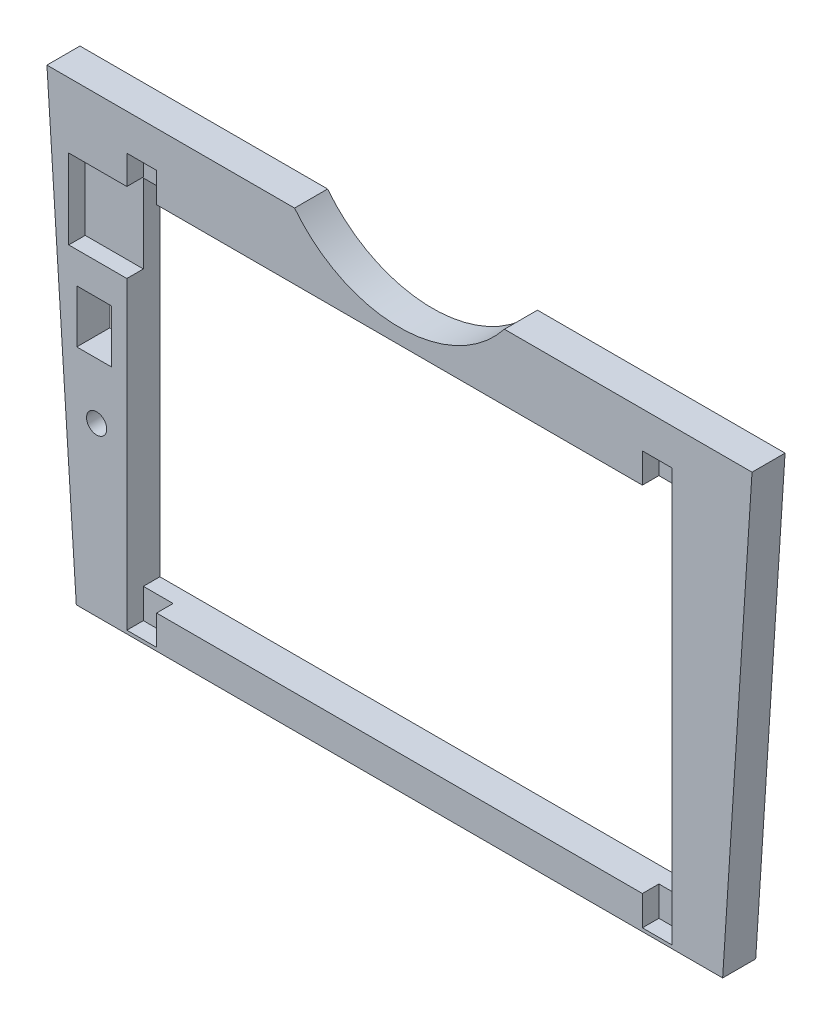
ISO-10303-21;
HEADER;
FILE_DESCRIPTION(('STEP AP214'),'2;1');
FILE_NAME('part.step','',(''),(''),'','','');
FILE_SCHEMA(('AUTOMOTIVE_DESIGN { 1 0 10303 214 1 1 1 1 }'));
ENDSEC;
DATA;
#1=APPLICATION_CONTEXT('core data for automotive mechanical design processes');
#2=APPLICATION_PROTOCOL_DEFINITION('international standard','automotive_design',2000,#1);
#3=PRODUCT_CONTEXT('',#1,'mechanical');
#4=PRODUCT('Part','Part','',(#3));
#5=PRODUCT_RELATED_PRODUCT_CATEGORY('part','',(#4));
#6=PRODUCT_DEFINITION_FORMATION('','',#4);
#7=PRODUCT_DEFINITION_CONTEXT('part definition',#1,'design');
#8=PRODUCT_DEFINITION('design','',#6,#7);
#9=PRODUCT_DEFINITION_SHAPE('','',#8);
#10=(LENGTH_UNIT() NAMED_UNIT(*) SI_UNIT(.MILLI.,.METRE.));
#11=(NAMED_UNIT(*) PLANE_ANGLE_UNIT() SI_UNIT($,.RADIAN.));
#12=(NAMED_UNIT(*) SI_UNIT($,.STERADIAN.) SOLID_ANGLE_UNIT());
#13=UNCERTAINTY_MEASURE_WITH_UNIT(LENGTH_MEASURE(1.E-05),#10,'distance_accuracy_value','');
#14=(GEOMETRIC_REPRESENTATION_CONTEXT(3) GLOBAL_UNCERTAINTY_ASSIGNED_CONTEXT((#13)) GLOBAL_UNIT_ASSIGNED_CONTEXT((#10,
#11,#12)) REPRESENTATION_CONTEXT('',''));
#15=CARTESIAN_POINT('',(0.,0.,0.));
#16=DIRECTION('',(0.,0.,1.));
#17=DIRECTION('',(1.,0.,0.));
#18=AXIS2_PLACEMENT_3D('',#15,#16,#17);
#19=CARTESIAN_POINT('',(-82.5,53.5,10.));
#20=DIRECTION('',(1.,0.,0.));
#21=DIRECTION('',(0.,0.,-1.));
#22=AXIS2_PLACEMENT_3D('',#19,#20,#21);
#23=PLANE('',#22);
#24=DIRECTION('',(0.,0.,1.));
#25=VECTOR('',#24,1.);
#26=CARTESIAN_POINT('',(-82.5,53.7645459232223,5.));
#27=LINE('',#26,#25);
#28=CARTESIAN_POINT('',(-82.5,53.7645459232223,5.));
#29=VERTEX_POINT('',#28);
#30=CARTESIAN_POINT('',(-82.5,53.7645459232223,10.));
#31=VERTEX_POINT('',#30);
#32=EDGE_CURVE('E337',#29,#31,#27,.T.);
#33=ORIENTED_EDGE('',*,*,#32,.F.);
#34=DIRECTION('',(0.,-1.,0.));
#35=VECTOR('',#34,1.);
#36=CARTESIAN_POINT('',(-82.5,53.5,5.));
#37=LINE('',#36,#35);
#38=CARTESIAN_POINT('',(-82.5,62.5,5.));
#39=VERTEX_POINT('',#38);
#40=EDGE_CURVE('E352',#39,#29,#37,.T.);
#41=ORIENTED_EDGE('',*,*,#40,.F.);
#42=DIRECTION('',(0.,0.,1.));
#43=VECTOR('',#42,1.);
#44=CARTESIAN_POINT('',(-82.5,62.5,5.));
#45=LINE('',#44,#43);
#46=CARTESIAN_POINT('',(-82.5,62.5,10.));
#47=VERTEX_POINT('',#46);
#48=EDGE_CURVE('E370',#39,#47,#45,.T.);
#49=ORIENTED_EDGE('',*,*,#48,.T.);
#50=DIRECTION('',(0.,-1.,0.));
#51=VECTOR('',#50,1.);
#52=CARTESIAN_POINT('',(-82.5,53.5,10.));
#53=LINE('',#52,#51);
#54=EDGE_CURVE('E401',#47,#31,#53,.T.);
#55=ORIENTED_EDGE('',*,*,#54,.T.);
#56=EDGE_LOOP('',(#33,#41,#49,#55));
#57=FACE_BOUND('',#56,.T.);
#58=ADVANCED_FACE('F33',(#57),#23,.T.);
#59=CARTESIAN_POINT('',(0.,98.4740542991967,10.));
#60=DIRECTION('',(0.,0.,1.));
#61=DIRECTION('',(1.,0.,0.));
#62=AXIS2_PLACEMENT_3D('',#59,#60,#61);
#63=PLANE('',#62);
#64=DIRECTION('',(1.,0.,0.));
#65=VECTOR('',#64,1.);
#66=CARTESIAN_POINT('',(-82.5,-62.5,10.));
#67=LINE('',#66,#65);
#68=CARTESIAN_POINT('',(-82.5,-62.5,10.));
#69=VERTEX_POINT('',#68);
#70=CARTESIAN_POINT('',(-73.5,-62.5,10.));
#71=VERTEX_POINT('',#70);
#72=EDGE_CURVE('E253',#69,#71,#67,.T.);
#73=ORIENTED_EDGE('',*,*,#72,.F.);
#74=CARTESIAN_POINT('',(-82.5,29.668881208007,10.));
#75=VERTEX_POINT('',#74);
#76=EDGE_CURVE('E238',#75,#69,#53,.T.);
#77=ORIENTED_EDGE('',*,*,#76,.F.);
#78=DIRECTION('',(1.,0.,0.));
#79=VECTOR('',#78,1.);
#80=CARTESIAN_POINT('',(-82.5,29.668881208007,10.));
#81=LINE('',#80,#79);
#82=CARTESIAN_POINT('',(-100.086391164183,29.668881208007,10.));
#83=VERTEX_POINT('',#82);
#84=EDGE_CURVE('E328',#83,#75,#81,.T.);
#85=ORIENTED_EDGE('',*,*,#84,.F.);
#86=DIRECTION('',(0.,-1.,0.));
#87=VECTOR('',#86,1.);
#88=CARTESIAN_POINT('',(-100.086391164183,53.7645459232223,10.));
#89=LINE('',#88,#87);
#90=CARTESIAN_POINT('',(-100.086391164183,53.7645459232223,10.));
#91=VERTEX_POINT('',#90);
#92=EDGE_CURVE('E340',#91,#83,#89,.T.);
#93=ORIENTED_EDGE('',*,*,#92,.F.);
#94=DIRECTION('',(-1.,0.,0.));
#95=VECTOR('',#94,1.);
#96=CARTESIAN_POINT('',(-82.5,53.7645459232223,10.));
#97=LINE('',#96,#95);
#98=EDGE_CURVE('E318',#31,#91,#97,.T.);
#99=ORIENTED_EDGE('',*,*,#98,.F.);
#100=ORIENTED_EDGE('',*,*,#54,.F.);
#101=DIRECTION('',(-1.,0.,0.));
#102=VECTOR('',#101,1.);
#103=CARTESIAN_POINT('',(-82.5,62.5,10.));
#104=LINE('',#103,#102);
#105=CARTESIAN_POINT('',(-73.5,62.5,10.));
#106=VERTEX_POINT('',#105);
#107=EDGE_CURVE('E356',#106,#47,#104,.T.);
#108=ORIENTED_EDGE('',*,*,#107,.F.);
#109=DIRECTION('',(0.,1.,0.));
#110=VECTOR('',#109,1.);
#111=CARTESIAN_POINT('',(-73.5,53.5,10.));
#112=LINE('',#111,#110);
#113=CARTESIAN_POINT('',(-73.5,53.5,10.));
#114=VERTEX_POINT('',#113);
#115=EDGE_CURVE('E346',#114,#106,#112,.T.);
#116=ORIENTED_EDGE('',*,*,#115,.F.);
#117=DIRECTION('',(-1.,0.,0.));
#118=VECTOR('',#117,1.);
#119=CARTESIAN_POINT('',(-82.5,53.5,10.));
#120=LINE('',#119,#118);
#121=CARTESIAN_POINT('',(73.5,53.5,10.));
#122=VERTEX_POINT('',#121);
#123=EDGE_CURVE('E408',#122,#114,#120,.T.);
#124=ORIENTED_EDGE('',*,*,#123,.F.);
#125=DIRECTION('',(0.,-1.,0.));
#126=VECTOR('',#125,1.);
#127=CARTESIAN_POINT('',(73.5,53.5,10.));
#128=LINE('',#127,#126);
#129=CARTESIAN_POINT('',(73.5,62.5,10.));
#130=VERTEX_POINT('',#129);
#131=EDGE_CURVE('E381',#130,#122,#128,.T.);
#132=ORIENTED_EDGE('',*,*,#131,.F.);
#133=DIRECTION('',(-1.,0.,0.));
#134=VECTOR('',#133,1.);
#135=CARTESIAN_POINT('',(82.5,62.5,10.));
#136=LINE('',#135,#134);
#137=CARTESIAN_POINT('',(82.5,62.5,10.));
#138=VERTEX_POINT('',#137);
#139=EDGE_CURVE('E373',#138,#130,#136,.T.);
#140=ORIENTED_EDGE('',*,*,#139,.F.);
#141=DIRECTION('',(0.,1.,0.));
#142=VECTOR('',#141,1.);
#143=CARTESIAN_POINT('',(82.5,53.5,10.));
#144=LINE('',#143,#142);
#145=CARTESIAN_POINT('',(82.5,-62.5,10.));
#146=VERTEX_POINT('',#145);
#147=EDGE_CURVE('E406',#146,#138,#144,.T.);
#148=ORIENTED_EDGE('',*,*,#147,.F.);
#149=DIRECTION('',(1.,0.,0.));
#150=VECTOR('',#149,1.);
#151=CARTESIAN_POINT('',(82.5,-62.5,10.));
#152=LINE('',#151,#150);
#153=CARTESIAN_POINT('',(73.5,-62.5,10.));
#154=VERTEX_POINT('',#153);
#155=EDGE_CURVE('E267',#154,#146,#152,.T.);
#156=ORIENTED_EDGE('',*,*,#155,.F.);
#157=DIRECTION('',(0.,-1.,0.));
#158=VECTOR('',#157,1.);
#159=CARTESIAN_POINT('',(73.5,-53.5,10.));
#160=LINE('',#159,#158);
#161=CARTESIAN_POINT('',(73.5,-53.5,10.));
#162=VERTEX_POINT('',#161);
#163=EDGE_CURVE('E262',#162,#154,#160,.T.);
#164=ORIENTED_EDGE('',*,*,#163,.F.);
#165=DIRECTION('',(1.,0.,0.));
#166=VECTOR('',#165,1.);
#167=CARTESIAN_POINT('',(-82.5,-53.5,10.));
#168=LINE('',#167,#166);
#169=CARTESIAN_POINT('',(-73.5,-53.5,10.));
#170=VERTEX_POINT('',#169);
#171=EDGE_CURVE('E404',#170,#162,#168,.T.);
#172=ORIENTED_EDGE('',*,*,#171,.F.);
#173=DIRECTION('',(0.,1.,0.));
#174=VECTOR('',#173,1.);
#175=CARTESIAN_POINT('',(-73.5,-53.5,10.));
#176=LINE('',#175,#174);
#177=EDGE_CURVE('E251',#71,#170,#176,.T.);
#178=ORIENTED_EDGE('',*,*,#177,.F.);
#179=EDGE_LOOP('',(#73,#77,#85,#93,#99,#100,#108,#116,#124,#132,#140,#148,#156,#164,#172,#178));
#180=FACE_BOUND('',#179,.T.);
#181=CARTESIAN_POINT('',(-91.6420336605306,-12.8753597057241,10.));
#182=DIRECTION('',(0.,0.,-1.));
#183=DIRECTION('',(-1.,0.,0.));
#184=AXIS2_PLACEMENT_3D('',#181,#182,#183);
#185=CIRCLE('',#184,3.04999999999999);
#186=CARTESIAN_POINT('',(-94.6920336605306,-12.8753597057241,10.));
#187=VERTEX_POINT('',#186);
#188=EDGE_CURVE('E289',#187,#187,#185,.T.);
#189=ORIENTED_EDGE('',*,*,#188,.T.);
#190=EDGE_LOOP('',(#189));
#191=FACE_BOUND('',#190,.T.);
#192=DIRECTION('',(0.,-1.,0.));
#193=VECTOR('',#192,1.);
#194=CARTESIAN_POINT('',(-87.1530670708154,20.1579655437856,10.));
#195=LINE('',#194,#193);
#196=CARTESIAN_POINT('',(-87.1530670708154,20.1579655437856,10.));
#197=VERTEX_POINT('',#196);
#198=CARTESIAN_POINT('',(-87.1530670708154,4.15796554378556,10.));
#199=VERTEX_POINT('',#198);
#200=EDGE_CURVE('E295',#197,#199,#195,.T.);
#201=ORIENTED_EDGE('',*,*,#200,.T.);
#202=DIRECTION('',(-1.,0.,0.));
#203=VECTOR('',#202,1.);
#204=CARTESIAN_POINT('',(-87.1530670708154,4.15796554378556,10.));
#205=LINE('',#204,#203);
#206=CARTESIAN_POINT('',(-97.6530670708154,4.15796554378556,10.));
#207=VERTEX_POINT('',#206);
#208=EDGE_CURVE('E298',#199,#207,#205,.T.);
#209=ORIENTED_EDGE('',*,*,#208,.T.);
#210=DIRECTION('',(0.,1.,0.));
#211=VECTOR('',#210,1.);
#212=CARTESIAN_POINT('',(-97.6530670708154,20.1579655437856,10.));
#213=LINE('',#212,#211);
#214=CARTESIAN_POINT('',(-97.6530670708154,20.1579655437856,10.));
#215=VERTEX_POINT('',#214);
#216=EDGE_CURVE('E56',#207,#215,#213,.T.);
#217=ORIENTED_EDGE('',*,*,#216,.T.);
#218=DIRECTION('',(1.,0.,0.));
#219=VECTOR('',#218,1.);
#220=CARTESIAN_POINT('',(-87.1530670708154,20.1579655437856,10.));
#221=LINE('',#220,#219);
#222=EDGE_CURVE('E303',#215,#197,#221,.T.);
#223=ORIENTED_EDGE('',*,*,#222,.T.);
#224=EDGE_LOOP('',(#201,#209,#217,#223));
#225=FACE_BOUND('',#224,.T.);
#226=DIRECTION('',(0.0647543211159097,-0.997901236544387,0.));
#227=VECTOR('',#226,1.);
#228=CARTESIAN_POINT('',(-106.68,73.5,10.));
#229=LINE('',#228,#227);
#230=CARTESIAN_POINT('',(-106.68,73.5,10.));
#231=VERTEX_POINT('',#230);
#232=CARTESIAN_POINT('',(-97.79,-63.5,10.));
#233=VERTEX_POINT('',#232);
#234=EDGE_CURVE('E431',#231,#233,#229,.T.);
#235=ORIENTED_EDGE('',*,*,#234,.T.);
#236=DIRECTION('',(1.,0.,0.));
#237=VECTOR('',#236,1.);
#238=CARTESIAN_POINT('',(-97.79,-63.5,10.));
#239=LINE('',#238,#237);
#240=CARTESIAN_POINT('',(97.79,-63.5,10.));
#241=VERTEX_POINT('',#240);
#242=EDGE_CURVE('E434',#233,#241,#239,.T.);
#243=ORIENTED_EDGE('',*,*,#242,.T.);
#244=DIRECTION('',(0.0647543211159093,0.997901236544388,0.));
#245=VECTOR('',#244,1.);
#246=CARTESIAN_POINT('',(106.68,73.5,10.));
#247=LINE('',#246,#245);
#248=CARTESIAN_POINT('',(106.68,73.5,10.));
#249=VERTEX_POINT('',#248);
#250=EDGE_CURVE('E437',#241,#249,#247,.T.);
#251=ORIENTED_EDGE('',*,*,#250,.T.);
#252=DIRECTION('',(-1.,0.,0.));
#253=VECTOR('',#252,1.);
#254=CARTESIAN_POINT('',(31.75,73.5,10.));
#255=LINE('',#254,#253);
#256=CARTESIAN_POINT('',(31.75,73.5,10.));
#257=VERTEX_POINT('',#256);
#258=EDGE_CURVE('E439',#249,#257,#255,.T.);
#259=ORIENTED_EDGE('',*,*,#258,.T.);
#260=CARTESIAN_POINT('',(0.,98.4740542991967,10.));
#261=DIRECTION('',(0.,0.,-1.));
#262=DIRECTION('',(1.,0.,0.));
#263=AXIS2_PLACEMENT_3D('',#260,#261,#262);
#264=CIRCLE('',#263,40.3951220834796);
#265=CARTESIAN_POINT('',(-31.75,73.5,10.));
#266=VERTEX_POINT('',#265);
#267=EDGE_CURVE('E441',#257,#266,#264,.T.);
#268=ORIENTED_EDGE('',*,*,#267,.T.);
#269=DIRECTION('',(-1.,0.,0.));
#270=VECTOR('',#269,1.);
#271=CARTESIAN_POINT('',(-106.68,73.5,10.));
#272=LINE('',#271,#270);
#273=EDGE_CURVE('E443',#266,#231,#272,.T.);
#274=ORIENTED_EDGE('',*,*,#273,.T.);
#275=EDGE_LOOP('',(#235,#243,#251,#259,#268,#274));
#276=FACE_BOUND('',#275,.T.);
#277=ADVANCED_FACE('F492',(#180,#191,#225,#276),#63,.T.);
#278=CARTESIAN_POINT('',(0.,98.4740542991967,0.));
#279=DIRECTION('',(0.,0.,1.));
#280=DIRECTION('',(1.,0.,0.));
#281=AXIS2_PLACEMENT_3D('',#278,#279,#280);
#282=PLANE('',#281);
#283=CARTESIAN_POINT('',(-91.6420336605306,-12.8753597057241,0.));
#284=DIRECTION('',(0.,0.,-1.));
#285=DIRECTION('',(-1.,0.,0.));
#286=AXIS2_PLACEMENT_3D('',#283,#284,#285);
#287=CIRCLE('',#286,3.04999999999999);
#288=CARTESIAN_POINT('',(-94.6920336605306,-12.8753597057241,0.));
#289=VERTEX_POINT('',#288);
#290=EDGE_CURVE('E284',#289,#289,#287,.T.);
#291=ORIENTED_EDGE('',*,*,#290,.F.);
#292=EDGE_LOOP('',(#291));
#293=FACE_BOUND('',#292,.T.);
#294=DIRECTION('',(-1.,0.,0.));
#295=VECTOR('',#294,1.);
#296=CARTESIAN_POINT('',(-87.1530670708154,4.15796554378556,0.));
#297=LINE('',#296,#295);
#298=CARTESIAN_POINT('',(-87.1530670708154,4.15796554378556,0.));
#299=VERTEX_POINT('',#298);
#300=CARTESIAN_POINT('',(-97.6530670708154,4.15796554378556,0.));
#301=VERTEX_POINT('',#300);
#302=EDGE_CURVE('E308',#299,#301,#297,.T.);
#303=ORIENTED_EDGE('',*,*,#302,.F.);
#304=DIRECTION('',(0.,-1.,0.));
#305=VECTOR('',#304,1.);
#306=CARTESIAN_POINT('',(-87.1530670708154,20.1579655437856,0.));
#307=LINE('',#306,#305);
#308=CARTESIAN_POINT('',(-87.1530670708154,20.1579655437856,0.));
#309=VERTEX_POINT('',#308);
#310=EDGE_CURVE('E292',#309,#299,#307,.T.);
#311=ORIENTED_EDGE('',*,*,#310,.F.);
#312=DIRECTION('',(1.,0.,0.));
#313=VECTOR('',#312,1.);
#314=CARTESIAN_POINT('',(-87.1530670708154,20.1579655437856,0.));
#315=LINE('',#314,#313);
#316=CARTESIAN_POINT('',(-97.6530670708154,20.1579655437856,0.));
#317=VERTEX_POINT('',#316);
#318=EDGE_CURVE('E299',#317,#309,#315,.T.);
#319=ORIENTED_EDGE('',*,*,#318,.F.);
#320=DIRECTION('',(0.,1.,0.));
#321=VECTOR('',#320,1.);
#322=CARTESIAN_POINT('',(-97.6530670708154,20.1579655437856,0.));
#323=LINE('',#322,#321);
#324=EDGE_CURVE('E311',#301,#317,#323,.T.);
#325=ORIENTED_EDGE('',*,*,#324,.F.);
#326=EDGE_LOOP('',(#303,#311,#319,#325));
#327=FACE_BOUND('',#326,.T.);
#328=DIRECTION('',(0.0647543211159097,-0.997901236544387,0.));
#329=VECTOR('',#328,1.);
#330=CARTESIAN_POINT('',(-106.68,73.5,0.));
#331=LINE('',#330,#329);
#332=CARTESIAN_POINT('',(-106.68,73.5,0.));
#333=VERTEX_POINT('',#332);
#334=CARTESIAN_POINT('',(-97.79,-63.5,0.));
#335=VERTEX_POINT('',#334);
#336=EDGE_CURVE('E430',#333,#335,#331,.T.);
#337=ORIENTED_EDGE('',*,*,#336,.F.);
#338=DIRECTION('',(-1.,0.,0.));
#339=VECTOR('',#338,1.);
#340=CARTESIAN_POINT('',(-106.68,73.5,0.));
#341=LINE('',#340,#339);
#342=CARTESIAN_POINT('',(-31.75,73.5,0.));
#343=VERTEX_POINT('',#342);
#344=EDGE_CURVE('E435',#343,#333,#341,.T.);
#345=ORIENTED_EDGE('',*,*,#344,.F.);
#346=CARTESIAN_POINT('',(0.,98.4740542991967,0.));
#347=DIRECTION('',(0.,0.,-1.));
#348=DIRECTION('',(1.,0.,0.));
#349=AXIS2_PLACEMENT_3D('',#346,#347,#348);
#350=CIRCLE('',#349,40.3951220834796);
#351=CARTESIAN_POINT('',(31.75,73.5,0.));
#352=VERTEX_POINT('',#351);
#353=EDGE_CURVE('E454',#352,#343,#350,.T.);
#354=ORIENTED_EDGE('',*,*,#353,.F.);
#355=DIRECTION('',(-1.,0.,0.));
#356=VECTOR('',#355,1.);
#357=CARTESIAN_POINT('',(31.75,73.5,0.));
#358=LINE('',#357,#356);
#359=CARTESIAN_POINT('',(106.68,73.5,0.));
#360=VERTEX_POINT('',#359);
#361=EDGE_CURVE('E452',#360,#352,#358,.T.);
#362=ORIENTED_EDGE('',*,*,#361,.F.);
#363=DIRECTION('',(0.0647543211159093,0.997901236544388,0.));
#364=VECTOR('',#363,1.);
#365=CARTESIAN_POINT('',(106.68,73.5,0.));
#366=LINE('',#365,#364);
#367=CARTESIAN_POINT('',(97.79,-63.5,0.));
#368=VERTEX_POINT('',#367);
#369=EDGE_CURVE('E450',#368,#360,#366,.T.);
#370=ORIENTED_EDGE('',*,*,#369,.F.);
#371=DIRECTION('',(1.,0.,0.));
#372=VECTOR('',#371,1.);
#373=CARTESIAN_POINT('',(-97.79,-63.5,0.));
#374=LINE('',#373,#372);
#375=EDGE_CURVE('E448',#335,#368,#374,.T.);
#376=ORIENTED_EDGE('',*,*,#375,.F.);
#377=EDGE_LOOP('',(#337,#345,#354,#362,#370,#376));
#378=FACE_BOUND('',#377,.T.);
#379=DIRECTION('',(0.,-1.,0.));
#380=VECTOR('',#379,1.);
#381=CARTESIAN_POINT('',(-82.5,53.5,0.));
#382=LINE('',#381,#380);
#383=CARTESIAN_POINT('',(-82.5,53.5,0.));
#384=VERTEX_POINT('',#383);
#385=CARTESIAN_POINT('',(-82.5,-53.5,0.));
#386=VERTEX_POINT('',#385);
#387=EDGE_CURVE('E396',#384,#386,#382,.T.);
#388=ORIENTED_EDGE('',*,*,#387,.T.);
#389=DIRECTION('',(1.,0.,0.));
#390=VECTOR('',#389,1.);
#391=CARTESIAN_POINT('',(-82.5,-53.5,0.));
#392=LINE('',#391,#390);
#393=CARTESIAN_POINT('',(82.5,-53.5,0.));
#394=VERTEX_POINT('',#393);
#395=EDGE_CURVE('E414',#386,#394,#392,.T.);
#396=ORIENTED_EDGE('',*,*,#395,.T.);
#397=DIRECTION('',(0.,1.,0.));
#398=VECTOR('',#397,1.);
#399=CARTESIAN_POINT('',(82.5,53.5,0.));
#400=LINE('',#399,#398);
#401=CARTESIAN_POINT('',(82.5,53.5,0.));
#402=VERTEX_POINT('',#401);
#403=EDGE_CURVE('E417',#394,#402,#400,.T.);
#404=ORIENTED_EDGE('',*,*,#403,.T.);
#405=DIRECTION('',(-1.,0.,0.));
#406=VECTOR('',#405,1.);
#407=CARTESIAN_POINT('',(-82.5,53.5,0.));
#408=LINE('',#407,#406);
#409=EDGE_CURVE('E420',#402,#384,#408,.T.);
#410=ORIENTED_EDGE('',*,*,#409,.T.);
#411=EDGE_LOOP('',(#388,#396,#404,#410));
#412=FACE_BOUND('',#411,.T.);
#413=ADVANCED_FACE('F478',(#293,#327,#378,#412),#282,.F.);
#414=CARTESIAN_POINT('',(-106.68,73.5,10.));
#415=DIRECTION('',(0.997901236544388,0.0647543211159097,0.));
#416=DIRECTION('',(-0.0647543211159097,0.997901236544388,0.));
#417=AXIS2_PLACEMENT_3D('',#414,#415,#416);
#418=PLANE('',#417);
#419=ORIENTED_EDGE('',*,*,#336,.T.);
#420=DIRECTION('',(0.,0.,-1.));
#421=VECTOR('',#420,1.);
#422=CARTESIAN_POINT('',(-97.79,-63.5,10.));
#423=LINE('',#422,#421);
#424=EDGE_CURVE('E11',#233,#335,#423,.T.);
#425=ORIENTED_EDGE('',*,*,#424,.F.);
#426=ORIENTED_EDGE('',*,*,#234,.F.);
#427=DIRECTION('',(0.,0.,-1.));
#428=VECTOR('',#427,1.);
#429=CARTESIAN_POINT('',(-106.68,73.5,10.));
#430=LINE('',#429,#428);
#431=EDGE_CURVE('E445',#231,#333,#430,.T.);
#432=ORIENTED_EDGE('',*,*,#431,.T.);
#433=EDGE_LOOP('',(#419,#425,#426,#432));
#434=FACE_BOUND('',#433,.T.);
#435=ADVANCED_FACE('F35',(#434),#418,.F.);
#436=CARTESIAN_POINT('',(-97.79,-63.5,10.));
#437=DIRECTION('',(0.,1.,0.));
#438=DIRECTION('',(0.,0.,1.));
#439=AXIS2_PLACEMENT_3D('',#436,#437,#438);
#440=PLANE('',#439);
#441=ORIENTED_EDGE('',*,*,#375,.T.);
#442=DIRECTION('',(0.,0.,-1.));
#443=VECTOR('',#442,1.);
#444=CARTESIAN_POINT('',(97.79,-63.5,10.));
#445=LINE('',#444,#443);
#446=EDGE_CURVE('E41',#241,#368,#445,.T.);
#447=ORIENTED_EDGE('',*,*,#446,.F.);
#448=ORIENTED_EDGE('',*,*,#242,.F.);
#449=ORIENTED_EDGE('',*,*,#424,.T.);
#450=EDGE_LOOP('',(#441,#447,#448,#449));
#451=FACE_BOUND('',#450,.T.);
#452=ADVANCED_FACE('F496',(#451),#440,.F.);
#453=CARTESIAN_POINT('',(106.68,73.5,10.));
#454=DIRECTION('',(-0.997901236544388,0.0647543211159093,0.));
#455=DIRECTION('',(-0.0647543211159093,-0.997901236544388,0.));
#456=AXIS2_PLACEMENT_3D('',#453,#454,#455);
#457=PLANE('',#456);
#458=ORIENTED_EDGE('',*,*,#369,.T.);
#459=DIRECTION('',(0.,0.,-1.));
#460=VECTOR('',#459,1.);
#461=CARTESIAN_POINT('',(106.68,73.5,10.));
#462=LINE('',#461,#460);
#463=EDGE_CURVE('E465',#249,#360,#462,.T.);
#464=ORIENTED_EDGE('',*,*,#463,.F.);
#465=ORIENTED_EDGE('',*,*,#250,.F.);
#466=ORIENTED_EDGE('',*,*,#446,.T.);
#467=EDGE_LOOP('',(#458,#464,#465,#466));
#468=FACE_BOUND('',#467,.T.);
#469=ADVANCED_FACE('F472',(#468),#457,.F.);
#470=CARTESIAN_POINT('',(31.75,73.5,10.));
#471=DIRECTION('',(0.,-1.,0.));
#472=DIRECTION('',(1.,0.,0.));
#473=AXIS2_PLACEMENT_3D('',#470,#471,#472);
#474=PLANE('',#473);
#475=ORIENTED_EDGE('',*,*,#361,.T.);
#476=DIRECTION('',(0.,0.,-1.));
#477=VECTOR('',#476,1.);
#478=CARTESIAN_POINT('',(31.75,73.5,10.));
#479=LINE('',#478,#477);
#480=EDGE_CURVE('E462',#257,#352,#479,.T.);
#481=ORIENTED_EDGE('',*,*,#480,.F.);
#482=ORIENTED_EDGE('',*,*,#258,.F.);
#483=ORIENTED_EDGE('',*,*,#463,.T.);
#484=EDGE_LOOP('',(#475,#481,#482,#483));
#485=FACE_BOUND('',#484,.T.);
#486=ADVANCED_FACE('F484',(#485),#474,.F.);
#487=CARTESIAN_POINT('',(0.,98.4740542991967,10.));
#488=DIRECTION('',(0.,0.,-1.));
#489=DIRECTION('',(-1.,0.,0.));
#490=AXIS2_PLACEMENT_3D('',#487,#488,#489);
#491=CYLINDRICAL_SURFACE('',#490,40.3951220834796);
#492=ORIENTED_EDGE('',*,*,#353,.T.);
#493=DIRECTION('',(0.,0.,-1.));
#494=VECTOR('',#493,1.);
#495=CARTESIAN_POINT('',(-31.75,73.5,10.));
#496=LINE('',#495,#494);
#497=EDGE_CURVE('E459',#266,#343,#496,.T.);
#498=ORIENTED_EDGE('',*,*,#497,.F.);
#499=ORIENTED_EDGE('',*,*,#267,.F.);
#500=ORIENTED_EDGE('',*,*,#480,.T.);
#501=EDGE_LOOP('',(#492,#498,#499,#500));
#502=FACE_BOUND('',#501,.T.);
#503=ADVANCED_FACE('F488',(#502),#491,.F.);
#504=CARTESIAN_POINT('',(-106.68,73.5,10.));
#505=DIRECTION('',(0.,-1.,0.));
#506=DIRECTION('',(0.,0.,-1.));
#507=AXIS2_PLACEMENT_3D('',#504,#505,#506);
#508=PLANE('',#507);
#509=ORIENTED_EDGE('',*,*,#344,.T.);
#510=ORIENTED_EDGE('',*,*,#431,.F.);
#511=ORIENTED_EDGE('',*,*,#273,.F.);
#512=ORIENTED_EDGE('',*,*,#497,.T.);
#513=EDGE_LOOP('',(#509,#510,#511,#512));
#514=FACE_BOUND('',#513,.T.);
#515=ADVANCED_FACE('F499',(#514),#508,.F.);
#516=DIRECTION('',(0.,0.,1.));
#517=VECTOR('',#516,1.);
#518=CARTESIAN_POINT('',(-82.5,29.668881208007,5.));
#519=LINE('',#518,#517);
#520=CARTESIAN_POINT('',(-82.5,29.668881208007,5.));
#521=VERTEX_POINT('',#520);
#522=EDGE_CURVE('E344',#521,#75,#519,.T.);
#523=ORIENTED_EDGE('',*,*,#522,.T.);
#524=ORIENTED_EDGE('',*,*,#76,.T.);
#525=DIRECTION('',(0.,0.,1.));
#526=VECTOR('',#525,1.);
#527=CARTESIAN_POINT('',(-82.5,-62.5,5.));
#528=LINE('',#527,#526);
#529=CARTESIAN_POINT('',(-82.5,-62.5,5.));
#530=VERTEX_POINT('',#529);
#531=EDGE_CURVE('E231',#530,#69,#528,.T.);
#532=ORIENTED_EDGE('',*,*,#531,.F.);
#533=DIRECTION('',(0.,-1.,0.));
#534=VECTOR('',#533,1.);
#535=CARTESIAN_POINT('',(-82.5,-53.5,5.));
#536=LINE('',#535,#534);
#537=CARTESIAN_POINT('',(-82.5,-53.5,5.));
#538=VERTEX_POINT('',#537);
#539=EDGE_CURVE('E236',#538,#530,#536,.T.);
#540=ORIENTED_EDGE('',*,*,#539,.F.);
#541=DIRECTION('',(0.,0.,-1.));
#542=VECTOR('',#541,1.);
#543=CARTESIAN_POINT('',(-82.5,-53.5,10.));
#544=LINE('',#543,#542);
#545=EDGE_CURVE('E428',#538,#386,#544,.T.);
#546=ORIENTED_EDGE('',*,*,#545,.T.);
#547=ORIENTED_EDGE('',*,*,#387,.F.);
#548=DIRECTION('',(0.,0.,-1.));
#549=VECTOR('',#548,1.);
#550=CARTESIAN_POINT('',(-82.5,53.5,10.));
#551=LINE('',#550,#549);
#552=CARTESIAN_POINT('',(-82.5,53.5,5.));
#553=VERTEX_POINT('',#552);
#554=EDGE_CURVE('E411',#553,#384,#551,.T.);
#555=ORIENTED_EDGE('',*,*,#554,.F.);
#556=DIRECTION('',(0.,1.,0.));
#557=VECTOR('',#556,1.);
#558=CARTESIAN_POINT('',(-82.5,53.7645459232223,5.));
#559=LINE('',#558,#557);
#560=EDGE_CURVE('E325',#521,#553,#559,.T.);
#561=ORIENTED_EDGE('',*,*,#560,.F.);
#562=EDGE_LOOP('',(#523,#524,#532,#540,#546,#547,#555,#561));
#563=FACE_BOUND('',#562,.T.);
#564=ADVANCED_FACE('F234',(#563),#23,.T.);
#565=CARTESIAN_POINT('',(-82.5,-53.5,10.));
#566=DIRECTION('',(0.,1.,0.));
#567=DIRECTION('',(0.,0.,1.));
#568=AXIS2_PLACEMENT_3D('',#565,#566,#567);
#569=PLANE('',#568);
#570=DIRECTION('',(0.,0.,1.));
#571=VECTOR('',#570,1.);
#572=CARTESIAN_POINT('',(-73.5,-53.5,5.));
#573=LINE('',#572,#571);
#574=CARTESIAN_POINT('',(-73.5,-53.5,5.));
#575=VERTEX_POINT('',#574);
#576=EDGE_CURVE('E259',#575,#170,#573,.T.);
#577=ORIENTED_EDGE('',*,*,#576,.T.);
#578=ORIENTED_EDGE('',*,*,#171,.T.);
#579=DIRECTION('',(0.,0.,1.));
#580=VECTOR('',#579,1.);
#581=CARTESIAN_POINT('',(73.5,-53.5,5.));
#582=LINE('',#581,#580);
#583=CARTESIAN_POINT('',(73.5,-53.5,5.));
#584=VERTEX_POINT('',#583);
#585=EDGE_CURVE('E276',#584,#162,#582,.T.);
#586=ORIENTED_EDGE('',*,*,#585,.F.);
#587=DIRECTION('',(-1.,0.,0.));
#588=VECTOR('',#587,1.);
#589=CARTESIAN_POINT('',(82.5,-53.5,5.));
#590=LINE('',#589,#588);
#591=CARTESIAN_POINT('',(82.5,-53.5,5.));
#592=VERTEX_POINT('',#591);
#593=EDGE_CURVE('E266',#592,#584,#590,.T.);
#594=ORIENTED_EDGE('',*,*,#593,.F.);
#595=DIRECTION('',(0.,0.,-1.));
#596=VECTOR('',#595,1.);
#597=CARTESIAN_POINT('',(82.5,-53.5,10.));
#598=LINE('',#597,#596);
#599=EDGE_CURVE('E426',#592,#394,#598,.T.);
#600=ORIENTED_EDGE('',*,*,#599,.T.);
#601=ORIENTED_EDGE('',*,*,#395,.F.);
#602=ORIENTED_EDGE('',*,*,#545,.F.);
#603=DIRECTION('',(-1.,0.,0.));
#604=VECTOR('',#603,1.);
#605=CARTESIAN_POINT('',(-82.5,-53.5,5.));
#606=LINE('',#605,#604);
#607=EDGE_CURVE('E243',#575,#538,#606,.T.);
#608=ORIENTED_EDGE('',*,*,#607,.F.);
#609=EDGE_LOOP('',(#577,#578,#586,#594,#600,#601,#602,#608));
#610=FACE_BOUND('',#609,.T.);
#611=ADVANCED_FACE('F506',(#610),#569,.T.);
#612=CARTESIAN_POINT('',(82.5,53.5,10.));
#613=DIRECTION('',(-1.,0.,0.));
#614=DIRECTION('',(0.,-1.,0.));
#615=AXIS2_PLACEMENT_3D('',#612,#613,#614);
#616=PLANE('',#615);
#617=ORIENTED_EDGE('',*,*,#403,.F.);
#618=ORIENTED_EDGE('',*,*,#599,.F.);
#619=DIRECTION('',(0.,1.,0.));
#620=VECTOR('',#619,1.);
#621=CARTESIAN_POINT('',(82.5,-53.5,5.));
#622=LINE('',#621,#620);
#623=CARTESIAN_POINT('',(82.5,-62.5,5.));
#624=VERTEX_POINT('',#623);
#625=EDGE_CURVE('E264',#624,#592,#622,.T.);
#626=ORIENTED_EDGE('',*,*,#625,.F.);
#627=DIRECTION('',(0.,0.,1.));
#628=VECTOR('',#627,1.);
#629=CARTESIAN_POINT('',(82.5,-62.5,5.));
#630=LINE('',#629,#628);
#631=EDGE_CURVE('E281',#624,#146,#630,.T.);
#632=ORIENTED_EDGE('',*,*,#631,.T.);
#633=ORIENTED_EDGE('',*,*,#147,.T.);
#634=DIRECTION('',(0.,0.,1.));
#635=VECTOR('',#634,1.);
#636=CARTESIAN_POINT('',(82.5,62.5,5.));
#637=LINE('',#636,#635);
#638=CARTESIAN_POINT('',(82.5,62.5,5.));
#639=VERTEX_POINT('',#638);
#640=EDGE_CURVE('E389',#639,#138,#637,.T.);
#641=ORIENTED_EDGE('',*,*,#640,.F.);
#642=DIRECTION('',(0.,1.,0.));
#643=VECTOR('',#642,1.);
#644=CARTESIAN_POINT('',(82.5,53.5,5.));
#645=LINE('',#644,#643);
#646=CARTESIAN_POINT('',(82.5,53.5,5.));
#647=VERTEX_POINT('',#646);
#648=EDGE_CURVE('E377',#647,#639,#645,.T.);
#649=ORIENTED_EDGE('',*,*,#648,.F.);
#650=DIRECTION('',(0.,0.,-1.));
#651=VECTOR('',#650,1.);
#652=CARTESIAN_POINT('',(82.5,53.5,10.));
#653=LINE('',#652,#651);
#654=EDGE_CURVE('E424',#647,#402,#653,.T.);
#655=ORIENTED_EDGE('',*,*,#654,.T.);
#656=EDGE_LOOP('',(#617,#618,#626,#632,#633,#641,#649,#655));
#657=FACE_BOUND('',#656,.T.);
#658=ADVANCED_FACE('F592',(#657),#616,.T.);
#659=CARTESIAN_POINT('',(-82.5,53.5,10.));
#660=DIRECTION('',(0.,-1.,0.));
#661=DIRECTION('',(0.,0.,-1.));
#662=AXIS2_PLACEMENT_3D('',#659,#660,#661);
#663=PLANE('',#662);
#664=DIRECTION('',(0.,0.,1.));
#665=VECTOR('',#664,1.);
#666=CARTESIAN_POINT('',(-73.5,53.5,5.));
#667=LINE('',#666,#665);
#668=CARTESIAN_POINT('',(-73.5,53.5,5.));
#669=VERTEX_POINT('',#668);
#670=EDGE_CURVE('E365',#669,#114,#667,.T.);
#671=ORIENTED_EDGE('',*,*,#670,.F.);
#672=DIRECTION('',(1.,0.,0.));
#673=VECTOR('',#672,1.);
#674=CARTESIAN_POINT('',(-82.5,53.5,5.));
#675=LINE('',#674,#673);
#676=EDGE_CURVE('E355',#553,#669,#675,.T.);
#677=ORIENTED_EDGE('',*,*,#676,.F.);
#678=ORIENTED_EDGE('',*,*,#554,.T.);
#679=ORIENTED_EDGE('',*,*,#409,.F.);
#680=ORIENTED_EDGE('',*,*,#654,.F.);
#681=DIRECTION('',(1.,0.,0.));
#682=VECTOR('',#681,1.);
#683=CARTESIAN_POINT('',(82.5,53.5,5.));
#684=LINE('',#683,#682);
#685=CARTESIAN_POINT('',(73.5,53.5,5.));
#686=VERTEX_POINT('',#685);
#687=EDGE_CURVE('E386',#686,#647,#684,.T.);
#688=ORIENTED_EDGE('',*,*,#687,.F.);
#689=DIRECTION('',(0.,0.,1.));
#690=VECTOR('',#689,1.);
#691=CARTESIAN_POINT('',(73.5,53.5,5.));
#692=LINE('',#691,#690);
#693=EDGE_CURVE('E393',#686,#122,#692,.T.);
#694=ORIENTED_EDGE('',*,*,#693,.T.);
#695=ORIENTED_EDGE('',*,*,#123,.T.);
#696=EDGE_LOOP('',(#671,#677,#678,#679,#680,#688,#694,#695));
#697=FACE_BOUND('',#696,.T.);
#698=ADVANCED_FACE('F586',(#697),#663,.T.);
#699=CARTESIAN_POINT('',(73.5,53.5,5.));
#700=DIRECTION('',(-1.,0.,0.));
#701=DIRECTION('',(0.,0.,1.));
#702=AXIS2_PLACEMENT_3D('',#699,#700,#701);
#703=PLANE('',#702);
#704=ORIENTED_EDGE('',*,*,#131,.T.);
#705=ORIENTED_EDGE('',*,*,#693,.F.);
#706=DIRECTION('',(0.,-1.,0.));
#707=VECTOR('',#706,1.);
#708=CARTESIAN_POINT('',(73.5,53.5,5.));
#709=LINE('',#708,#707);
#710=CARTESIAN_POINT('',(73.5,62.5,5.));
#711=VERTEX_POINT('',#710);
#712=EDGE_CURVE('E384',#711,#686,#709,.T.);
#713=ORIENTED_EDGE('',*,*,#712,.F.);
#714=DIRECTION('',(0.,0.,1.));
#715=VECTOR('',#714,1.);
#716=CARTESIAN_POINT('',(73.5,62.5,5.));
#717=LINE('',#716,#715);
#718=EDGE_CURVE('E397',#711,#130,#717,.T.);
#719=ORIENTED_EDGE('',*,*,#718,.T.);
#720=EDGE_LOOP('',(#704,#705,#713,#719));
#721=FACE_BOUND('',#720,.T.);
#722=ADVANCED_FACE('F583',(#721),#703,.F.);
#723=CARTESIAN_POINT('',(82.5,62.5,5.));
#724=DIRECTION('',(0.,1.,0.));
#725=DIRECTION('',(0.,0.,1.));
#726=AXIS2_PLACEMENT_3D('',#723,#724,#725);
#727=PLANE('',#726);
#728=ORIENTED_EDGE('',*,*,#139,.T.);
#729=ORIENTED_EDGE('',*,*,#718,.F.);
#730=DIRECTION('',(-1.,0.,0.));
#731=VECTOR('',#730,1.);
#732=CARTESIAN_POINT('',(82.5,62.5,5.));
#733=LINE('',#732,#731);
#734=EDGE_CURVE('E380',#639,#711,#733,.T.);
#735=ORIENTED_EDGE('',*,*,#734,.F.);
#736=ORIENTED_EDGE('',*,*,#640,.T.);
#737=EDGE_LOOP('',(#728,#729,#735,#736));
#738=FACE_BOUND('',#737,.T.);
#739=ADVANCED_FACE('F581',(#738),#727,.F.);
#740=CARTESIAN_POINT('',(0.,0.,5.));
#741=DIRECTION('',(0.,0.,1.));
#742=DIRECTION('',(1.,0.,0.));
#743=AXIS2_PLACEMENT_3D('',#740,#741,#742);
#744=PLANE('',#743);
#745=ORIENTED_EDGE('',*,*,#648,.T.);
#746=ORIENTED_EDGE('',*,*,#734,.T.);
#747=ORIENTED_EDGE('',*,*,#712,.T.);
#748=ORIENTED_EDGE('',*,*,#687,.T.);
#749=EDGE_LOOP('',(#745,#746,#747,#748));
#750=FACE_BOUND('',#749,.T.);
#751=ADVANCED_FACE('F574',(#750),#744,.T.);
#752=CARTESIAN_POINT('',(-82.5,62.5,5.));
#753=DIRECTION('',(0.,1.,0.));
#754=DIRECTION('',(0.,0.,1.));
#755=AXIS2_PLACEMENT_3D('',#752,#753,#754);
#756=PLANE('',#755);
#757=ORIENTED_EDGE('',*,*,#107,.T.);
#758=ORIENTED_EDGE('',*,*,#48,.F.);
#759=DIRECTION('',(-1.,0.,0.));
#760=VECTOR('',#759,1.);
#761=CARTESIAN_POINT('',(-82.5,62.5,5.));
#762=LINE('',#761,#760);
#763=CARTESIAN_POINT('',(-73.5,62.5,5.));
#764=VERTEX_POINT('',#763);
#765=EDGE_CURVE('E362',#764,#39,#762,.T.);
#766=ORIENTED_EDGE('',*,*,#765,.F.);
#767=DIRECTION('',(0.,0.,1.));
#768=VECTOR('',#767,1.);
#769=CARTESIAN_POINT('',(-73.5,62.5,5.));
#770=LINE('',#769,#768);
#771=EDGE_CURVE('E374',#764,#106,#770,.T.);
#772=ORIENTED_EDGE('',*,*,#771,.T.);
#773=EDGE_LOOP('',(#757,#758,#766,#772));
#774=FACE_BOUND('',#773,.T.);
#775=ADVANCED_FACE('F571',(#774),#756,.F.);
#776=CARTESIAN_POINT('',(-73.5,53.5,5.));
#777=DIRECTION('',(1.,0.,0.));
#778=DIRECTION('',(0.,0.,-1.));
#779=AXIS2_PLACEMENT_3D('',#776,#777,#778);
#780=PLANE('',#779);
#781=ORIENTED_EDGE('',*,*,#115,.T.);
#782=ORIENTED_EDGE('',*,*,#771,.F.);
#783=DIRECTION('',(0.,1.,0.));
#784=VECTOR('',#783,1.);
#785=CARTESIAN_POINT('',(-73.5,53.5,5.));
#786=LINE('',#785,#784);
#787=EDGE_CURVE('E359',#669,#764,#786,.T.);
#788=ORIENTED_EDGE('',*,*,#787,.F.);
#789=ORIENTED_EDGE('',*,*,#670,.T.);
#790=EDGE_LOOP('',(#781,#782,#788,#789));
#791=FACE_BOUND('',#790,.T.);
#792=ADVANCED_FACE('F569',(#791),#780,.F.);
#793=CARTESIAN_POINT('',(0.,0.,5.));
#794=DIRECTION('',(0.,0.,-1.));
#795=DIRECTION('',(-1.,0.,0.));
#796=AXIS2_PLACEMENT_3D('',#793,#794,#795);
#797=PLANE('',#796);
#798=ORIENTED_EDGE('',*,*,#40,.T.);
#799=DIRECTION('',(-1.,0.,0.));
#800=VECTOR('',#799,1.);
#801=CARTESIAN_POINT('',(-82.5,53.7645459232223,5.));
#802=LINE('',#801,#800);
#803=CARTESIAN_POINT('',(-100.086391164183,53.7645459232223,5.));
#804=VERTEX_POINT('',#803);
#805=EDGE_CURVE('E327',#29,#804,#802,.T.);
#806=ORIENTED_EDGE('',*,*,#805,.T.);
#807=DIRECTION('',(0.,-1.,0.));
#808=VECTOR('',#807,1.);
#809=CARTESIAN_POINT('',(-100.086391164183,53.7645459232223,5.));
#810=LINE('',#809,#808);
#811=CARTESIAN_POINT('',(-100.086391164183,29.668881208007,5.));
#812=VERTEX_POINT('',#811);
#813=EDGE_CURVE('E331',#804,#812,#810,.T.);
#814=ORIENTED_EDGE('',*,*,#813,.T.);
#815=DIRECTION('',(1.,0.,0.));
#816=VECTOR('',#815,1.);
#817=CARTESIAN_POINT('',(-82.5,29.668881208007,5.));
#818=LINE('',#817,#816);
#819=EDGE_CURVE('E334',#812,#521,#818,.T.);
#820=ORIENTED_EDGE('',*,*,#819,.T.);
#821=ORIENTED_EDGE('',*,*,#560,.T.);
#822=ORIENTED_EDGE('',*,*,#676,.T.);
#823=ORIENTED_EDGE('',*,*,#787,.T.);
#824=ORIENTED_EDGE('',*,*,#765,.T.);
#825=EDGE_LOOP('',(#798,#806,#814,#820,#821,#822,#823,#824));
#826=FACE_BOUND('',#825,.T.);
#827=ADVANCED_FACE('F559',(#826),#797,.F.);
#828=CARTESIAN_POINT('',(-82.5,29.668881208007,5.));
#829=DIRECTION('',(0.,-1.,0.));
#830=DIRECTION('',(0.,0.,-1.));
#831=AXIS2_PLACEMENT_3D('',#828,#829,#830);
#832=PLANE('',#831);
#833=ORIENTED_EDGE('',*,*,#84,.T.);
#834=ORIENTED_EDGE('',*,*,#522,.F.);
#835=ORIENTED_EDGE('',*,*,#819,.F.);
#836=DIRECTION('',(0.,0.,1.));
#837=VECTOR('',#836,1.);
#838=CARTESIAN_POINT('',(-100.086391164183,29.668881208007,5.));
#839=LINE('',#838,#837);
#840=EDGE_CURVE('E347',#812,#83,#839,.T.);
#841=ORIENTED_EDGE('',*,*,#840,.T.);
#842=EDGE_LOOP('',(#833,#834,#835,#841));
#843=FACE_BOUND('',#842,.T.);
#844=ADVANCED_FACE('F555',(#843),#832,.F.);
#845=CARTESIAN_POINT('',(-100.086391164183,53.7645459232223,5.));
#846=DIRECTION('',(-1.,0.,0.));
#847=DIRECTION('',(0.,0.,1.));
#848=AXIS2_PLACEMENT_3D('',#845,#846,#847);
#849=PLANE('',#848);
#850=ORIENTED_EDGE('',*,*,#92,.T.);
#851=ORIENTED_EDGE('',*,*,#840,.F.);
#852=ORIENTED_EDGE('',*,*,#813,.F.);
#853=DIRECTION('',(0.,0.,1.));
#854=VECTOR('',#853,1.);
#855=CARTESIAN_POINT('',(-100.086391164183,53.7645459232223,5.));
#856=LINE('',#855,#854);
#857=EDGE_CURVE('E349',#804,#91,#856,.T.);
#858=ORIENTED_EDGE('',*,*,#857,.T.);
#859=EDGE_LOOP('',(#850,#851,#852,#858));
#860=FACE_BOUND('',#859,.T.);
#861=ADVANCED_FACE('F558',(#860),#849,.F.);
#862=CARTESIAN_POINT('',(-82.5,53.7645459232223,5.));
#863=DIRECTION('',(0.,1.,0.));
#864=DIRECTION('',(0.,0.,1.));
#865=AXIS2_PLACEMENT_3D('',#862,#863,#864);
#866=PLANE('',#865);
#867=ORIENTED_EDGE('',*,*,#98,.T.);
#868=ORIENTED_EDGE('',*,*,#857,.F.);
#869=ORIENTED_EDGE('',*,*,#805,.F.);
#870=ORIENTED_EDGE('',*,*,#32,.T.);
#871=EDGE_LOOP('',(#867,#868,#869,#870));
#872=FACE_BOUND('',#871,.T.);
#873=ADVANCED_FACE('F554',(#872),#866,.F.);
#874=CARTESIAN_POINT('',(-87.1530670708154,20.1579655437856,10.));
#875=DIRECTION('',(1.,0.,0.));
#876=DIRECTION('',(0.,0.,-1.));
#877=AXIS2_PLACEMENT_3D('',#874,#875,#876);
#878=PLANE('',#877);
#879=ORIENTED_EDGE('',*,*,#310,.T.);
#880=DIRECTION('',(0.,0.,-1.));
#881=VECTOR('',#880,1.);
#882=CARTESIAN_POINT('',(-87.1530670708154,4.15796554378556,10.));
#883=LINE('',#882,#881);
#884=EDGE_CURVE('E306',#199,#299,#883,.T.);
#885=ORIENTED_EDGE('',*,*,#884,.F.);
#886=ORIENTED_EDGE('',*,*,#200,.F.);
#887=DIRECTION('',(0.,0.,-1.));
#888=VECTOR('',#887,1.);
#889=CARTESIAN_POINT('',(-87.1530670708154,20.1579655437856,10.));
#890=LINE('',#889,#888);
#891=EDGE_CURVE('E316',#197,#309,#890,.T.);
#892=ORIENTED_EDGE('',*,*,#891,.T.);
#893=EDGE_LOOP('',(#879,#885,#886,#892));
#894=FACE_BOUND('',#893,.T.);
#895=ADVANCED_FACE('F536',(#894),#878,.F.);
#896=CARTESIAN_POINT('',(-87.1530670708154,20.1579655437856,10.));
#897=DIRECTION('',(0.,1.,0.));
#898=DIRECTION('',(0.,0.,1.));
#899=AXIS2_PLACEMENT_3D('',#896,#897,#898);
#900=PLANE('',#899);
#901=ORIENTED_EDGE('',*,*,#318,.T.);
#902=ORIENTED_EDGE('',*,*,#891,.F.);
#903=ORIENTED_EDGE('',*,*,#222,.F.);
#904=DIRECTION('',(0.,0.,-1.));
#905=VECTOR('',#904,1.);
#906=CARTESIAN_POINT('',(-97.6530670708154,20.1579655437856,10.));
#907=LINE('',#906,#905);
#908=EDGE_CURVE('E319',#215,#317,#907,.T.);
#909=ORIENTED_EDGE('',*,*,#908,.T.);
#910=EDGE_LOOP('',(#901,#902,#903,#909));
#911=FACE_BOUND('',#910,.T.);
#912=ADVANCED_FACE('F539',(#911),#900,.F.);
#913=CARTESIAN_POINT('',(-97.6530670708154,20.1579655437856,10.));
#914=DIRECTION('',(-1.,0.,0.));
#915=DIRECTION('',(0.,0.,1.));
#916=AXIS2_PLACEMENT_3D('',#913,#914,#915);
#917=PLANE('',#916);
#918=ORIENTED_EDGE('',*,*,#324,.T.);
#919=ORIENTED_EDGE('',*,*,#908,.F.);
#920=ORIENTED_EDGE('',*,*,#216,.F.);
#921=DIRECTION('',(0.,0.,-1.));
#922=VECTOR('',#921,1.);
#923=CARTESIAN_POINT('',(-97.6530670708154,4.15796554378556,10.));
#924=LINE('',#923,#922);
#925=EDGE_CURVE('E321',#207,#301,#924,.T.);
#926=ORIENTED_EDGE('',*,*,#925,.T.);
#927=EDGE_LOOP('',(#918,#919,#920,#926));
#928=FACE_BOUND('',#927,.T.);
#929=ADVANCED_FACE('F540',(#928),#917,.F.);
#930=CARTESIAN_POINT('',(-87.1530670708154,4.15796554378556,10.));
#931=DIRECTION('',(0.,-1.,0.));
#932=DIRECTION('',(0.,0.,-1.));
#933=AXIS2_PLACEMENT_3D('',#930,#931,#932);
#934=PLANE('',#933);
#935=ORIENTED_EDGE('',*,*,#302,.T.);
#936=ORIENTED_EDGE('',*,*,#925,.F.);
#937=ORIENTED_EDGE('',*,*,#208,.F.);
#938=ORIENTED_EDGE('',*,*,#884,.T.);
#939=EDGE_LOOP('',(#935,#936,#937,#938));
#940=FACE_BOUND('',#939,.T.);
#941=ADVANCED_FACE('F532',(#940),#934,.F.);
#942=CARTESIAN_POINT('',(-91.6420336605306,-12.8753597057241,10.));
#943=DIRECTION('',(0.,0.,-1.));
#944=DIRECTION('',(-1.,0.,0.));
#945=AXIS2_PLACEMENT_3D('',#942,#943,#944);
#946=CYLINDRICAL_SURFACE('',#945,3.04999999999999);
#947=ORIENTED_EDGE('',*,*,#188,.F.);
#948=EDGE_LOOP('',(#947));
#949=FACE_BOUND('',#948,.T.);
#950=ORIENTED_EDGE('',*,*,#290,.T.);
#951=EDGE_LOOP('',(#950));
#952=FACE_BOUND('',#951,.T.);
#953=ADVANCED_FACE('F547',(#949,#952),#946,.F.);
#954=CARTESIAN_POINT('',(82.5,-62.5,5.));
#955=DIRECTION('',(0.,-1.,0.));
#956=DIRECTION('',(0.,0.,-1.));
#957=AXIS2_PLACEMENT_3D('',#954,#955,#956);
#958=PLANE('',#957);
#959=ORIENTED_EDGE('',*,*,#155,.T.);
#960=ORIENTED_EDGE('',*,*,#631,.F.);
#961=DIRECTION('',(1.,0.,0.));
#962=VECTOR('',#961,1.);
#963=CARTESIAN_POINT('',(82.5,-62.5,5.));
#964=LINE('',#963,#962);
#965=CARTESIAN_POINT('',(73.5,-62.5,5.));
#966=VERTEX_POINT('',#965);
#967=EDGE_CURVE('E273',#966,#624,#964,.T.);
#968=ORIENTED_EDGE('',*,*,#967,.F.);
#969=DIRECTION('',(0.,0.,1.));
#970=VECTOR('',#969,1.);
#971=CARTESIAN_POINT('',(73.5,-62.5,5.));
#972=LINE('',#971,#970);
#973=EDGE_CURVE('E285',#966,#154,#972,.T.);
#974=ORIENTED_EDGE('',*,*,#973,.T.);
#975=EDGE_LOOP('',(#959,#960,#968,#974));
#976=FACE_BOUND('',#975,.T.);
#977=ADVANCED_FACE('F614',(#976),#958,.F.);
#978=CARTESIAN_POINT('',(73.5,-53.5,5.));
#979=DIRECTION('',(-1.,0.,0.));
#980=DIRECTION('',(0.,0.,1.));
#981=AXIS2_PLACEMENT_3D('',#978,#979,#980);
#982=PLANE('',#981);
#983=ORIENTED_EDGE('',*,*,#163,.T.);
#984=ORIENTED_EDGE('',*,*,#973,.F.);
#985=DIRECTION('',(0.,-1.,0.));
#986=VECTOR('',#985,1.);
#987=CARTESIAN_POINT('',(73.5,-53.5,5.));
#988=LINE('',#987,#986);
#989=EDGE_CURVE('E270',#584,#966,#988,.T.);
#990=ORIENTED_EDGE('',*,*,#989,.F.);
#991=ORIENTED_EDGE('',*,*,#585,.T.);
#992=EDGE_LOOP('',(#983,#984,#990,#991));
#993=FACE_BOUND('',#992,.T.);
#994=ADVANCED_FACE('F638',(#993),#982,.F.);
#995=CARTESIAN_POINT('',(0.,0.,5.));
#996=DIRECTION('',(0.,0.,-1.));
#997=DIRECTION('',(-1.,0.,0.));
#998=AXIS2_PLACEMENT_3D('',#995,#996,#997);
#999=PLANE('',#998);
#1000=ORIENTED_EDGE('',*,*,#625,.T.);
#1001=ORIENTED_EDGE('',*,*,#593,.T.);
#1002=ORIENTED_EDGE('',*,*,#989,.T.);
#1003=ORIENTED_EDGE('',*,*,#967,.T.);
#1004=EDGE_LOOP('',(#1000,#1001,#1002,#1003));
#1005=FACE_BOUND('',#1004,.T.);
#1006=ADVANCED_FACE('F610',(#1005),#999,.F.);
#1007=CARTESIAN_POINT('',(-73.5,-53.5,5.));
#1008=DIRECTION('',(1.,0.,0.));
#1009=DIRECTION('',(0.,0.,-1.));
#1010=AXIS2_PLACEMENT_3D('',#1007,#1008,#1009);
#1011=PLANE('',#1010);
#1012=ORIENTED_EDGE('',*,*,#177,.T.);
#1013=ORIENTED_EDGE('',*,*,#576,.F.);
#1014=DIRECTION('',(0.,1.,0.));
#1015=VECTOR('',#1014,1.);
#1016=CARTESIAN_POINT('',(-73.5,-53.5,5.));
#1017=LINE('',#1016,#1015);
#1018=CARTESIAN_POINT('',(-73.5,-62.5,5.));
#1019=VERTEX_POINT('',#1018);
#1020=EDGE_CURVE('E48',#1019,#575,#1017,.T.);
#1021=ORIENTED_EDGE('',*,*,#1020,.F.);
#1022=DIRECTION('',(0.,0.,1.));
#1023=VECTOR('',#1022,1.);
#1024=CARTESIAN_POINT('',(-73.5,-62.5,5.));
#1025=LINE('',#1024,#1023);
#1026=EDGE_CURVE('E242',#1019,#71,#1025,.T.);
#1027=ORIENTED_EDGE('',*,*,#1026,.T.);
#1028=EDGE_LOOP('',(#1012,#1013,#1021,#1027));
#1029=FACE_BOUND('',#1028,.T.);
#1030=ADVANCED_FACE('F636',(#1029),#1011,.F.);
#1031=CARTESIAN_POINT('',(-82.5,-62.5,5.));
#1032=DIRECTION('',(0.,-1.,0.));
#1033=DIRECTION('',(0.,0.,-1.));
#1034=AXIS2_PLACEMENT_3D('',#1031,#1032,#1033);
#1035=PLANE('',#1034);
#1036=ORIENTED_EDGE('',*,*,#72,.T.);
#1037=ORIENTED_EDGE('',*,*,#1026,.F.);
#1038=DIRECTION('',(1.,0.,0.));
#1039=VECTOR('',#1038,1.);
#1040=CARTESIAN_POINT('',(-82.5,-62.5,5.));
#1041=LINE('',#1040,#1039);
#1042=EDGE_CURVE('E245',#530,#1019,#1041,.T.);
#1043=ORIENTED_EDGE('',*,*,#1042,.F.);
#1044=ORIENTED_EDGE('',*,*,#531,.T.);
#1045=EDGE_LOOP('',(#1036,#1037,#1043,#1044));
#1046=FACE_BOUND('',#1045,.T.);
#1047=ADVANCED_FACE('F246',(#1046),#1035,.F.);
#1048=CARTESIAN_POINT('',(0.,0.,5.));
#1049=DIRECTION('',(0.,0.,1.));
#1050=DIRECTION('',(1.,0.,0.));
#1051=AXIS2_PLACEMENT_3D('',#1048,#1049,#1050);
#1052=PLANE('',#1051);
#1053=ORIENTED_EDGE('',*,*,#539,.T.);
#1054=ORIENTED_EDGE('',*,*,#1042,.T.);
#1055=ORIENTED_EDGE('',*,*,#1020,.T.);
#1056=ORIENTED_EDGE('',*,*,#607,.T.);
#1057=EDGE_LOOP('',(#1053,#1054,#1055,#1056));
#1058=FACE_BOUND('',#1057,.T.);
#1059=ADVANCED_FACE('F248',(#1058),#1052,.T.);
#1060=CLOSED_SHELL('',(#58,#277,#413,#435,#452,#469,#486,#503,#515,#564,#611,#658,#698,#722,
#739,#751,#775,#792,#827,#844,#861,#873,#895,#912,#929,#941,#953,#977,#994,#1006,#1030,#1047,#1059));
#1061=MANIFOLD_SOLID_BREP('B2',#1060);
#1062=ADVANCED_BREP_SHAPE_REPRESENTATION('',(#18,#1061),#14);
#1063=SHAPE_DEFINITION_REPRESENTATION(#9,#1062);
ENDSEC;
END-ISO-10303-21;
